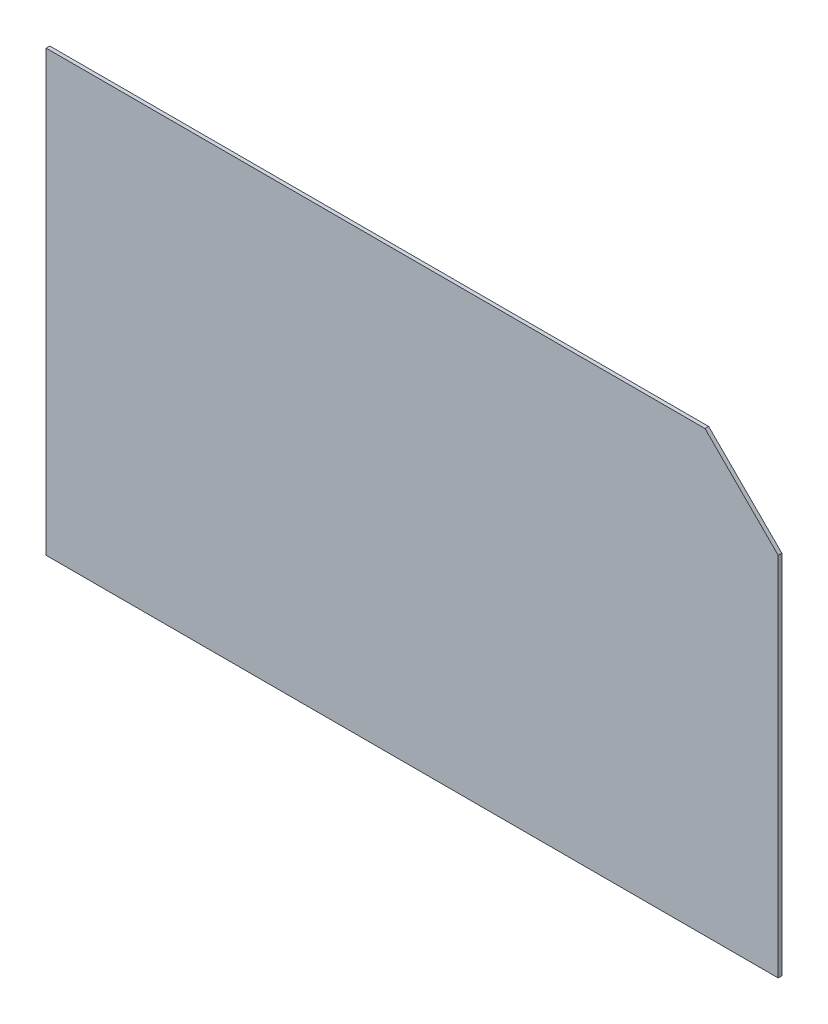
ISO-10303-21;
HEADER;
FILE_DESCRIPTION(('STEP AP214'),'2;1');
FILE_NAME('part.step','',(''),(''),'','','');
FILE_SCHEMA(('AUTOMOTIVE_DESIGN { 1 0 10303 214 1 1 1 1 }'));
ENDSEC;
DATA;
#1=APPLICATION_CONTEXT('core data for automotive mechanical design processes');
#2=APPLICATION_PROTOCOL_DEFINITION('international standard','automotive_design',2000,#1);
#3=PRODUCT_CONTEXT('',#1,'mechanical');
#4=PRODUCT('Part','Part','',(#3));
#5=PRODUCT_RELATED_PRODUCT_CATEGORY('part','',(#4));
#6=PRODUCT_DEFINITION_FORMATION('','',#4);
#7=PRODUCT_DEFINITION_CONTEXT('part definition',#1,'design');
#8=PRODUCT_DEFINITION('design','',#6,#7);
#9=PRODUCT_DEFINITION_SHAPE('','',#8);
#10=(LENGTH_UNIT() NAMED_UNIT(*) SI_UNIT(.MILLI.,.METRE.));
#11=(NAMED_UNIT(*) PLANE_ANGLE_UNIT() SI_UNIT($,.RADIAN.));
#12=(NAMED_UNIT(*) SI_UNIT($,.STERADIAN.) SOLID_ANGLE_UNIT());
#13=UNCERTAINTY_MEASURE_WITH_UNIT(LENGTH_MEASURE(1.E-05),#10,'distance_accuracy_value','');
#14=(GEOMETRIC_REPRESENTATION_CONTEXT(3) GLOBAL_UNCERTAINTY_ASSIGNED_CONTEXT((#13)) GLOBAL_UNIT_ASSIGNED_CONTEXT((#10,
#11,#12)) REPRESENTATION_CONTEXT('',''));
#15=CARTESIAN_POINT('',(0.,0.,0.));
#16=DIRECTION('',(0.,0.,1.));
#17=DIRECTION('',(1.,0.,0.));
#18=AXIS2_PLACEMENT_3D('',#15,#16,#17);
#19=CARTESIAN_POINT('',(-2500.,1500.,-25.));
#20=DIRECTION('',(-1.,0.,0.));
#21=DIRECTION('',(0.,-1.,0.));
#22=AXIS2_PLACEMENT_3D('',#19,#20,#21);
#23=PLANE('',#22);
#24=DIRECTION('',(0.,-1.,0.));
#25=VECTOR('',#24,1.);
#26=CARTESIAN_POINT('',(-2500.,1500.,0.));
#27=LINE('',#26,#25);
#28=CARTESIAN_POINT('',(-2500.,1500.,0.));
#29=VERTEX_POINT('',#28);
#30=CARTESIAN_POINT('',(-2500.,-1500.,0.));
#31=VERTEX_POINT('',#30);
#32=EDGE_CURVE('E119',#29,#31,#27,.T.);
#33=ORIENTED_EDGE('',*,*,#32,.F.);
#34=DIRECTION('',(0.,0.,1.));
#35=VECTOR('',#34,1.);
#36=CARTESIAN_POINT('',(-2500.,1500.,-25.));
#37=LINE('',#36,#35);
#38=CARTESIAN_POINT('',(-2500.,1500.,-25.));
#39=VERTEX_POINT('',#38);
#40=EDGE_CURVE('E11',#39,#29,#37,.T.);
#41=ORIENTED_EDGE('',*,*,#40,.F.);
#42=DIRECTION('',(0.,-1.,0.));
#43=VECTOR('',#42,1.);
#44=CARTESIAN_POINT('',(-2500.,1500.,-25.));
#45=LINE('',#44,#43);
#46=CARTESIAN_POINT('',(-2500.,-1500.,-25.));
#47=VERTEX_POINT('',#46);
#48=EDGE_CURVE('E117',#39,#47,#45,.T.);
#49=ORIENTED_EDGE('',*,*,#48,.T.);
#50=DIRECTION('',(0.,0.,1.));
#51=VECTOR('',#50,1.);
#52=CARTESIAN_POINT('',(-2500.,-1500.,-25.));
#53=LINE('',#52,#51);
#54=EDGE_CURVE('E42',#47,#31,#53,.T.);
#55=ORIENTED_EDGE('',*,*,#54,.T.);
#56=EDGE_LOOP('',(#33,#41,#49,#55));
#57=FACE_BOUND('',#56,.T.);
#58=ADVANCED_FACE('F39',(#57),#23,.T.);
#59=CARTESIAN_POINT('',(-2500.,1500.,-25.));
#60=DIRECTION('',(0.,1.,0.));
#61=DIRECTION('',(0.,0.,1.));
#62=AXIS2_PLACEMENT_3D('',#59,#60,#61);
#63=PLANE('',#62);
#64=DIRECTION('',(0.,0.,1.));
#65=VECTOR('',#64,1.);
#66=CARTESIAN_POINT('',(2000.,1500.,-932.));
#67=LINE('',#66,#65);
#68=CARTESIAN_POINT('',(2000.,1500.,-25.));
#69=VERTEX_POINT('',#68);
#70=CARTESIAN_POINT('',(2000.,1500.,0.));
#71=VERTEX_POINT('',#70);
#72=EDGE_CURVE('E56',#69,#71,#67,.T.);
#73=ORIENTED_EDGE('',*,*,#72,.F.);
#74=DIRECTION('',(-1.,0.,0.));
#75=VECTOR('',#74,1.);
#76=CARTESIAN_POINT('',(-2500.,1500.,-25.));
#77=LINE('',#76,#75);
#78=EDGE_CURVE('E63',#69,#39,#77,.T.);
#79=ORIENTED_EDGE('',*,*,#78,.T.);
#80=ORIENTED_EDGE('',*,*,#40,.T.);
#81=DIRECTION('',(-1.,0.,0.));
#82=VECTOR('',#81,1.);
#83=CARTESIAN_POINT('',(-2500.,1500.,0.));
#84=LINE('',#83,#82);
#85=EDGE_CURVE('E81',#71,#29,#84,.T.);
#86=ORIENTED_EDGE('',*,*,#85,.F.);
#87=EDGE_LOOP('',(#73,#79,#80,#86));
#88=FACE_BOUND('',#87,.T.);
#89=ADVANCED_FACE('F146',(#88),#63,.T.);
#90=CARTESIAN_POINT('',(2500.,1500.,-25.));
#91=DIRECTION('',(1.,0.,0.));
#92=DIRECTION('',(0.,1.,0.));
#93=AXIS2_PLACEMENT_3D('',#90,#91,#92);
#94=PLANE('',#93);
#95=DIRECTION('',(0.,0.,1.));
#96=VECTOR('',#95,1.);
#97=CARTESIAN_POINT('',(2500.,1000.,-932.));
#98=LINE('',#97,#96);
#99=CARTESIAN_POINT('',(2500.,1000.,-25.));
#100=VERTEX_POINT('',#99);
#101=CARTESIAN_POINT('',(2500.,1000.,0.));
#102=VERTEX_POINT('',#101);
#103=EDGE_CURVE('E96',#100,#102,#98,.T.);
#104=ORIENTED_EDGE('',*,*,#103,.T.);
#105=DIRECTION('',(0.,1.,0.));
#106=VECTOR('',#105,1.);
#107=CARTESIAN_POINT('',(2500.,1500.,0.));
#108=LINE('',#107,#106);
#109=CARTESIAN_POINT('',(2500.,-1500.,0.));
#110=VERTEX_POINT('',#109);
#111=EDGE_CURVE('E105',#110,#102,#108,.T.);
#112=ORIENTED_EDGE('',*,*,#111,.F.);
#113=DIRECTION('',(0.,0.,1.));
#114=VECTOR('',#113,1.);
#115=CARTESIAN_POINT('',(2500.,-1500.,-25.));
#116=LINE('',#115,#114);
#117=CARTESIAN_POINT('',(2500.,-1500.,-25.));
#118=VERTEX_POINT('',#117);
#119=EDGE_CURVE('E48',#118,#110,#116,.T.);
#120=ORIENTED_EDGE('',*,*,#119,.F.);
#121=DIRECTION('',(0.,1.,0.));
#122=VECTOR('',#121,1.);
#123=CARTESIAN_POINT('',(2500.,1500.,-25.));
#124=LINE('',#123,#122);
#125=EDGE_CURVE('E108',#118,#100,#124,.T.);
#126=ORIENTED_EDGE('',*,*,#125,.T.);
#127=EDGE_LOOP('',(#104,#112,#120,#126));
#128=FACE_BOUND('',#127,.T.);
#129=ADVANCED_FACE('F104',(#128),#94,.T.);
#130=CARTESIAN_POINT('',(-2500.,-1500.,-25.));
#131=DIRECTION('',(0.,-1.,0.));
#132=DIRECTION('',(0.,0.,-1.));
#133=AXIS2_PLACEMENT_3D('',#130,#131,#132);
#134=PLANE('',#133);
#135=DIRECTION('',(1.,0.,0.));
#136=VECTOR('',#135,1.);
#137=CARTESIAN_POINT('',(-2500.,-1500.,0.));
#138=LINE('',#137,#136);
#139=EDGE_CURVE('E112',#31,#110,#138,.T.);
#140=ORIENTED_EDGE('',*,*,#139,.F.);
#141=ORIENTED_EDGE('',*,*,#54,.F.);
#142=DIRECTION('',(1.,0.,0.));
#143=VECTOR('',#142,1.);
#144=CARTESIAN_POINT('',(-2500.,-1500.,-25.));
#145=LINE('',#144,#143);
#146=EDGE_CURVE('E130',#47,#118,#145,.T.);
#147=ORIENTED_EDGE('',*,*,#146,.T.);
#148=ORIENTED_EDGE('',*,*,#119,.T.);
#149=EDGE_LOOP('',(#140,#141,#147,#148));
#150=FACE_BOUND('',#149,.T.);
#151=ADVANCED_FACE('F143',(#150),#134,.T.);
#152=CARTESIAN_POINT('',(0.,0.,-25.));
#153=DIRECTION('',(0.,0.,1.));
#154=DIRECTION('',(1.,0.,0.));
#155=AXIS2_PLACEMENT_3D('',#152,#153,#154);
#156=PLANE('',#155);
#157=ORIENTED_EDGE('',*,*,#78,.F.);
#158=DIRECTION('',(0.707106781186544,-0.707106781186551,0.));
#159=VECTOR('',#158,1.);
#160=CARTESIAN_POINT('',(1750.00000000001,1750.,-25.));
#161=LINE('',#160,#159);
#162=EDGE_CURVE('E134',#69,#100,#161,.T.);
#163=ORIENTED_EDGE('',*,*,#162,.T.);
#164=ORIENTED_EDGE('',*,*,#125,.F.);
#165=ORIENTED_EDGE('',*,*,#146,.F.);
#166=ORIENTED_EDGE('',*,*,#48,.F.);
#167=EDGE_LOOP('',(#157,#163,#164,#165,#166));
#168=FACE_BOUND('',#167,.T.);
#169=ADVANCED_FACE('F145',(#168),#156,.F.);
#170=CARTESIAN_POINT('',(0.,0.,0.));
#171=DIRECTION('',(0.,0.,1.));
#172=DIRECTION('',(1.,0.,0.));
#173=AXIS2_PLACEMENT_3D('',#170,#171,#172);
#174=PLANE('',#173);
#175=DIRECTION('',(0.707106781186544,-0.707106781186551,0.));
#176=VECTOR('',#175,1.);
#177=CARTESIAN_POINT('',(2000.,1500.,0.));
#178=LINE('',#177,#176);
#179=EDGE_CURVE('E93',#71,#102,#178,.T.);
#180=ORIENTED_EDGE('',*,*,#179,.F.);
#181=ORIENTED_EDGE('',*,*,#85,.T.);
#182=ORIENTED_EDGE('',*,*,#32,.T.);
#183=ORIENTED_EDGE('',*,*,#139,.T.);
#184=ORIENTED_EDGE('',*,*,#111,.T.);
#185=EDGE_LOOP('',(#180,#181,#182,#183,#184));
#186=FACE_BOUND('',#185,.T.);
#187=ADVANCED_FACE('F111',(#186),#174,.T.);
#188=CARTESIAN_POINT('',(2000.,1500.,-932.));
#189=DIRECTION('',(-0.707106781186551,-0.707106781186544,0.));
#190=DIRECTION('',(0.707106781186544,-0.707106781186551,0.));
#191=AXIS2_PLACEMENT_3D('',#188,#189,#190);
#192=PLANE('',#191);
#193=ORIENTED_EDGE('',*,*,#72,.T.);
#194=ORIENTED_EDGE('',*,*,#179,.T.);
#195=ORIENTED_EDGE('',*,*,#103,.F.);
#196=ORIENTED_EDGE('',*,*,#162,.F.);
#197=EDGE_LOOP('',(#193,#194,#195,#196));
#198=FACE_BOUND('',#197,.T.);
#199=ADVANCED_FACE('F95',(#198),#192,.F.);
#200=CLOSED_SHELL('',(#58,#89,#129,#151,#169,#187,#199));
#201=MANIFOLD_SOLID_BREP('B2',#200);
#202=ADVANCED_BREP_SHAPE_REPRESENTATION('',(#18,#201),#14);
#203=SHAPE_DEFINITION_REPRESENTATION(#9,#202);
ENDSEC;
END-ISO-10303-21;
